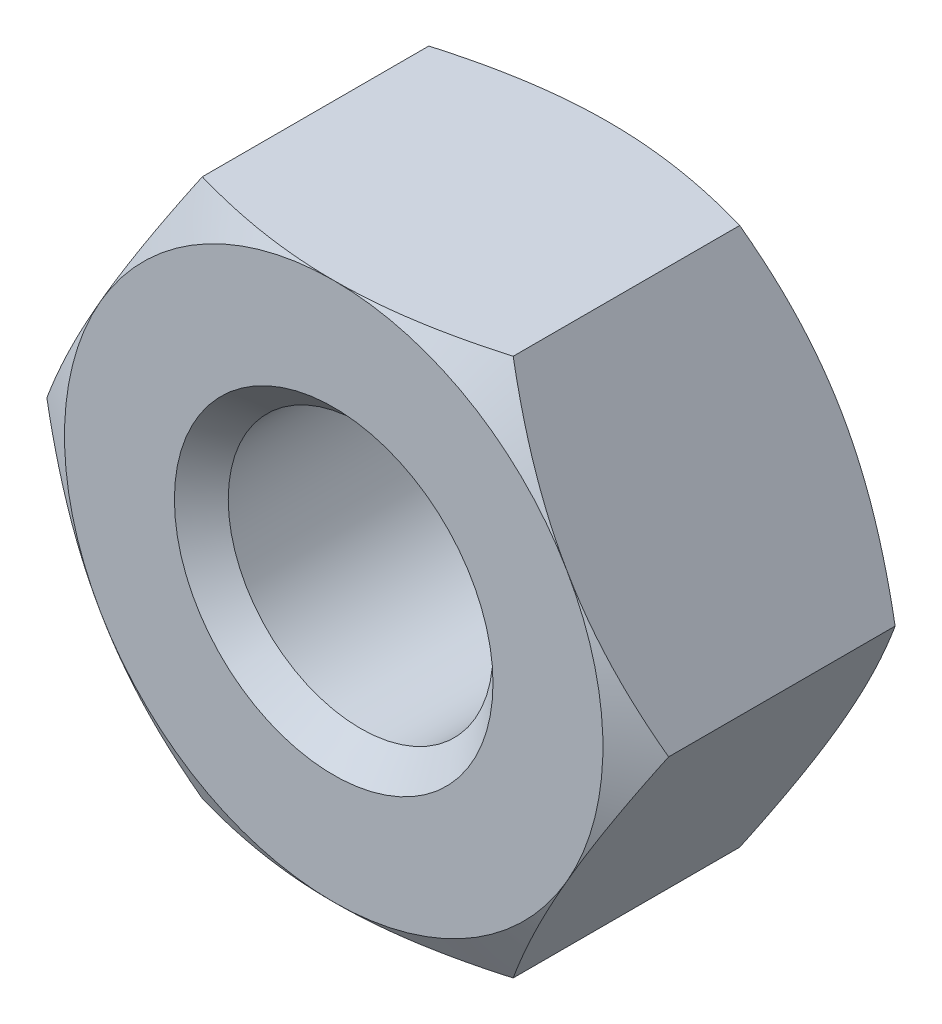
ISO-10303-21;
HEADER;
FILE_DESCRIPTION(('STEP AP214'),'2;1');
FILE_NAME('part.step','',(''),(''),'','','');
FILE_SCHEMA(('AUTOMOTIVE_DESIGN { 1 0 10303 214 1 1 1 1 }'));
ENDSEC;
DATA;
#1=APPLICATION_CONTEXT('core data for automotive mechanical design processes');
#2=APPLICATION_PROTOCOL_DEFINITION('international standard','automotive_design',2000,#1);
#3=PRODUCT_CONTEXT('',#1,'mechanical');
#4=PRODUCT('Part','Part','',(#3));
#5=PRODUCT_RELATED_PRODUCT_CATEGORY('part','',(#4));
#6=PRODUCT_DEFINITION_FORMATION('','',#4);
#7=PRODUCT_DEFINITION_CONTEXT('part definition',#1,'design');
#8=PRODUCT_DEFINITION('design','',#6,#7);
#9=PRODUCT_DEFINITION_SHAPE('','',#8);
#10=(LENGTH_UNIT() NAMED_UNIT(*) SI_UNIT(.MILLI.,.METRE.));
#11=(NAMED_UNIT(*) PLANE_ANGLE_UNIT() SI_UNIT($,.RADIAN.));
#12=(NAMED_UNIT(*) SI_UNIT($,.STERADIAN.) SOLID_ANGLE_UNIT());
#13=UNCERTAINTY_MEASURE_WITH_UNIT(LENGTH_MEASURE(1.E-05),#10,'distance_accuracy_value','');
#14=(GEOMETRIC_REPRESENTATION_CONTEXT(3) GLOBAL_UNCERTAINTY_ASSIGNED_CONTEXT((#13)) GLOBAL_UNIT_ASSIGNED_CONTEXT((#10,
#11,#12)) REPRESENTATION_CONTEXT('',''));
#15=CARTESIAN_POINT('',(0.,0.,0.));
#16=DIRECTION('',(0.,0.,1.));
#17=DIRECTION('',(1.,0.,0.));
#18=AXIS2_PLACEMENT_3D('',#15,#16,#17);
#19=CARTESIAN_POINT('',(-5.77350269189626,0.,5.1));
#20=DIRECTION('',(0.866025403784439,0.5,0.));
#21=DIRECTION('',(-0.5,0.866025403784439,0.));
#22=AXIS2_PLACEMENT_3D('',#19,#20,#21);
#23=PLANE('',#22);
#24=CARTESIAN_POINT('',(-2.88663587589429,-5.0002,0.446648656051829));
#25=CARTESIAN_POINT('',(-3.01349970319368,-4.78046540547481,0.373386567637635));
#26=CARTESIAN_POINT('',(-3.14144859993849,-4.55885141554042,0.306751321918092));
#27=CARTESIAN_POINT('',(-3.39956193532121,-4.11178600454648,0.19043899101081));
#28=CARTESIAN_POINT('',(-3.52973095989718,-3.88632664040922,0.140803049915788));
#29=CARTESIAN_POINT('',(-3.78847564779798,-3.43816769477649,0.0635510254186966));
#30=CARTESIAN_POINT('',(-3.91701101576052,-3.2155379068958,0.0354203782834878));
#31=CARTESIAN_POINT('',(-4.11026620624323,-2.88081009815335,0.0101949219536832));
#32=CARTESIAN_POINT('',(-4.17472868879311,-2.76915780319493,0.00461345976948283));
#33=CARTESIAN_POINT('',(-4.30371322717528,-2.5457500293262,-0.000797783248530725));
#34=CARTESIAN_POINT('',(-4.36823528110589,-2.43399455370968,-0.000627741741797583));
#35=CARTESIAN_POINT('',(-4.54500768479194,-2.12781576914936,0.00775363179203579));
#36=CARTESIAN_POINT('',(-4.65719946015293,-1.93349391403278,0.0218297718972512));
#37=CARTESIAN_POINT('',(-4.88083840557981,-1.54613989800229,0.066465257109431));
#38=CARTESIAN_POINT('',(-4.9922847895602,-1.35310909862843,0.0970398601475082));
#39=CARTESIAN_POINT('',(-5.21637431361295,-0.964974657525143,0.173468493621164));
#40=CARTESIAN_POINT('',(-5.32898917185759,-0.769920001358262,0.21964637887868));
#41=CARTESIAN_POINT('',(-5.55253939626498,-0.382719654641231,0.324451794491934));
#42=CARTESIAN_POINT('',(-5.66347762579591,-0.190569004591913,0.383054703437374));
#43=CARTESIAN_POINT('',(-5.77361816195009,0.000199999999999551,0.446648656051829));
#44=B_SPLINE_CURVE_WITH_KNOTS('',3,(#24,#25,#26,#27,#28,#29,#30,#31,#32,#33,#34,#35,#36,#37,#38,
#39,#40,#41,#42,#43),.UNSPECIFIED.,.F.,.F.,(4,2,2,2,2,2,2,2,2,4),(0.,0.792555841363091,
1.58701660053334,2.36181537487281,2.74884076077326,3.13585419177295,3.80962362599679,
4.48401723901189,5.17336882348928,5.86136694793725),.UNSPECIFIED.);
#45=CARTESIAN_POINT('',(-2.88675134594813,-5.,0.446581987385202));
#46=VERTEX_POINT('',#45);
#47=CARTESIAN_POINT('',(-4.3301270189222,-2.5,0.));
#48=VERTEX_POINT('',#47);
#49=EDGE_CURVE('E625',#46,#48,#44,.T.);
#50=ORIENTED_EDGE('',*,*,#49,.F.);
#51=DIRECTION('',(0.,0.,-1.));
#52=VECTOR('',#51,1.);
#53=CARTESIAN_POINT('',(-2.88675134594813,-5.,5.1));
#54=LINE('',#53,#52);
#55=CARTESIAN_POINT('',(-2.88675134594813,-5.,4.6534180126148));
#56=VERTEX_POINT('',#55);
#57=EDGE_CURVE('E133',#56,#46,#54,.T.);
#58=ORIENTED_EDGE('',*,*,#57,.F.);
#59=CARTESIAN_POINT('',(-2.88663587589429,-5.0002,4.65335134394817));
#60=CARTESIAN_POINT('',(-3.01349970319368,-4.78046540547481,4.72661343236237));
#61=CARTESIAN_POINT('',(-3.14144859993849,-4.55885141554042,4.79324867808191));
#62=CARTESIAN_POINT('',(-3.39956193532121,-4.11178600454648,4.90956100898919));
#63=CARTESIAN_POINT('',(-3.52973095989718,-3.88632664040922,4.95919695008421));
#64=CARTESIAN_POINT('',(-3.78847564779798,-3.43816769477649,5.0364489745813));
#65=CARTESIAN_POINT('',(-3.91701101576052,-3.2155379068958,5.06457962171651));
#66=CARTESIAN_POINT('',(-4.11026620624323,-2.88081009815335,5.08980507804632));
#67=CARTESIAN_POINT('',(-4.17472868879311,-2.76915780319493,5.09538654023052));
#68=CARTESIAN_POINT('',(-4.30371322717528,-2.5457500293262,5.10079778324853));
#69=CARTESIAN_POINT('',(-4.36823528110589,-2.43399455370968,5.1006277417418));
#70=CARTESIAN_POINT('',(-4.54500768479194,-2.12781576914936,5.09224636820796));
#71=CARTESIAN_POINT('',(-4.65719946015293,-1.93349391403278,5.07817022810275));
#72=CARTESIAN_POINT('',(-4.88083840557981,-1.54613989800229,5.03353474289057));
#73=CARTESIAN_POINT('',(-4.9922847895602,-1.35310909862843,5.00296013985249));
#74=CARTESIAN_POINT('',(-5.21637431361295,-0.964974657525143,4.92653150637884));
#75=CARTESIAN_POINT('',(-5.32898917185759,-0.769920001358262,4.88035362112132));
#76=CARTESIAN_POINT('',(-5.55253939626498,-0.382719654641231,4.77554820550807));
#77=CARTESIAN_POINT('',(-5.66347762579591,-0.190569004591913,4.71694529656263));
#78=CARTESIAN_POINT('',(-5.77361816195009,0.000199999999999537,4.65335134394817));
#79=B_SPLINE_CURVE_WITH_KNOTS('',3,(#59,#60,#61,#62,#63,#64,#65,#66,#67,#68,#69,#70,#71,#72,#73,
#74,#75,#76,#77,#78),.UNSPECIFIED.,.F.,.F.,(4,2,2,2,2,2,2,2,2,4),(0.,0.792555841363091,
1.58701660053334,2.36181537487281,2.74884076077326,3.13585419177295,3.80962362599679,
4.48401723901189,5.17336882348928,5.86136694793725),.UNSPECIFIED.);
#80=CARTESIAN_POINT('',(-4.3301270189222,-2.5,5.1));
#81=VERTEX_POINT('',#80);
#82=EDGE_CURVE('E622',#56,#81,#79,.T.);
#83=ORIENTED_EDGE('',*,*,#82,.T.);
#84=CARTESIAN_POINT('',(-5.77350269189626,0.,4.6534180126148));
#85=VERTEX_POINT('',#84);
#86=EDGE_CURVE('E222',#81,#85,#79,.T.);
#87=ORIENTED_EDGE('',*,*,#86,.T.);
#88=DIRECTION('',(0.,0.,-1.));
#89=VECTOR('',#88,1.);
#90=CARTESIAN_POINT('',(-5.77350269189626,0.,5.1));
#91=LINE('',#90,#89);
#92=CARTESIAN_POINT('',(-5.77350269189626,0.,0.446581987385203));
#93=VERTEX_POINT('',#92);
#94=EDGE_CURVE('E210',#85,#93,#91,.T.);
#95=ORIENTED_EDGE('',*,*,#94,.T.);
#96=EDGE_CURVE('E219',#48,#93,#44,.T.);
#97=ORIENTED_EDGE('',*,*,#96,.F.);
#98=EDGE_LOOP('',(#50,#58,#83,#87,#95,#97));
#99=FACE_BOUND('',#98,.T.);
#100=ADVANCED_FACE('F15',(#99),#23,.F.);
#101=CARTESIAN_POINT('',(-2.88675134594813,-5.,5.1));
#102=DIRECTION('',(0.,1.,0.));
#103=DIRECTION('',(-1.,0.,0.));
#104=AXIS2_PLACEMENT_3D('',#101,#102,#103);
#105=PLANE('',#104);
#106=CARTESIAN_POINT('',(-7.65608998744864,-4.99999999999999,2.39263352655079));
#107=CARTESIAN_POINT('',(-7.43656171400165,-5.,2.28654533817206));
#108=CARTESIAN_POINT('',(-7.21651440170021,-5.,2.18151175461595));
#109=CARTESIAN_POINT('',(-6.77510105921518,-5.,1.97415643363975));
#110=CARTESIAN_POINT('',(-6.55373480873052,-5.,1.87183516574568));
#111=CARTESIAN_POINT('',(-6.10820714710356,-5.,1.6699680785349));
#112=CARTESIAN_POINT('',(-5.88403698971123,-5.,1.5704414928173));
#113=CARTESIAN_POINT('',(-5.43385418074676,-5.,1.37566323278681));
#114=CARTESIAN_POINT('',(-5.20784162594277,-5.,1.28041133564242));
#115=CARTESIAN_POINT('',(-4.75080884782755,-5.,1.09418830918941));
#116=CARTESIAN_POINT('',(-4.51976121099504,-5.,1.00328409099869));
#117=CARTESIAN_POINT('',(-4.05494053422099,-5.,0.828595302971944));
#118=CARTESIAN_POINT('',(-3.82116719434024,-5.,0.744811525247647));
#119=CARTESIAN_POINT('',(-3.35100416711888,-5.,0.586614632364614));
#120=CARTESIAN_POINT('',(-3.11462125088187,-5.,0.512181595225267));
#121=CARTESIAN_POINT('',(-2.63849247870023,-5.,0.375104393872373));
#122=CARTESIAN_POINT('',(-2.39874771210329,-5.,0.312456501596946));
#123=CARTESIAN_POINT('',(-1.91574303714496,-5.,0.201987753994866));
#124=CARTESIAN_POINT('',(-1.67248221084099,-5.,0.154170846558639));
#125=CARTESIAN_POINT('',(-1.18299359688663,-5.,0.0765955557923999));
#126=CARTESIAN_POINT('',(-0.936765806613275,-5.,0.0468371884284065));
#127=CARTESIAN_POINT('',(-0.567032279323842,-5.,0.0176512015862943));
#128=CARTESIAN_POINT('',(-0.444105297658534,-5.,0.0104963190599451));
#129=CARTESIAN_POINT('',(-0.19805300523856,-5.,0.00139545226903921));
#130=CARTESIAN_POINT('',(-0.0749276970802241,-5.,-0.00055059963961613));
#131=CARTESIAN_POINT('',(0.171257999892357,-5.,0.000818470345662526));
#132=CARTESIAN_POINT('',(0.294318397227092,-5.,0.00413211431301022));
#133=CARTESIAN_POINT('',(0.540192730788844,-5.,0.0159365972827587));
#134=CARTESIAN_POINT('',(0.663006654263487,-5.,0.0244276975701636));
#135=CARTESIAN_POINT('',(0.960681872881671,-5.,0.0511063802752996));
#136=CARTESIAN_POINT('',(1.1353143627994,-5.,0.0718889676982853));
#137=CARTESIAN_POINT('',(1.48321675799389,-5.,0.122765655722695));
#138=CARTESIAN_POINT('',(1.65648647841237,-5.,0.152860997990034));
#139=CARTESIAN_POINT('',(2.001554260587,-5.,0.221298792011551));
#140=CARTESIAN_POINT('',(2.17335067370374,-5.,0.259649477486405));
#141=CARTESIAN_POINT('',(2.51518168221055,-5.,0.343428305385012));
#142=CARTESIAN_POINT('',(2.68521638419311,-5.,0.388856016914002));
#143=CARTESIAN_POINT('',(3.02770318928893,-5.,0.486887782054294));
#144=CARTESIAN_POINT('',(3.20011248435313,-5.,0.539640363823944));
#145=CARTESIAN_POINT('',(3.54310870430178,-5.,0.650357787302628));
#146=CARTESIAN_POINT('',(3.71369679659716,-5.,0.708319033907072));
#147=CARTESIAN_POINT('',(4.05236610267975,-5.,0.828256540728477));
#148=CARTESIAN_POINT('',(4.22045602230057,-5.,0.890208365426368));
#149=CARTESIAN_POINT('',(4.5553317168745,-5.,1.01774823413812));
#150=CARTESIAN_POINT('',(4.72211693321416,-5.,1.08333774778778));
#151=CARTESIAN_POINT('',(4.88829623733357,-5.,1.15038625817725));
#152=B_SPLINE_CURVE_WITH_KNOTS('',3,(#106,#107,#108,#109,#110,#111,#112,#113,#114,#115,#116,
#117,#118,#119,#120,#121,#122,#123,#124,#125,#126,#127,#128,#129,#130,#131,#132,#133,#134,#135,
#136,#137,#138,#139,#140,#141,#142,#143,#144,#145,#146,#147,#148,#149,#150,#151),.UNSPECIFIED.,
.F.,.F.,(4,2,2,2,2,2,2,2,2,2,2,2,2,2,2,2,2,2,2,2,2,2,4),(0.,0.731464740665349,1.46305528824908,
2.19883243307486,2.93457117856033,3.67934251246857,4.42419659013361,5.16743580871989,
5.91043951739338,6.65364083834806,7.39684281638515,7.76615414335456,8.1354606742661,
8.50466345177855,8.87388486298452,9.40118542949727,9.92855633110015,10.4564556797854,
10.9843228991235,11.525120280828,12.065547221064,12.6029322754131,13.1405360390026),.UNSPECIFIED.);
#153=CARTESIAN_POINT('',(2.88675134594813,-5.,0.446581987385203));
#154=VERTEX_POINT('',#153);
#155=CARTESIAN_POINT('',(0.,-5.,0.));
#156=VERTEX_POINT('',#155);
#157=EDGE_CURVE('E114',#154,#156,#152,.F.);
#158=ORIENTED_EDGE('',*,*,#157,.F.);
#159=DIRECTION('',(0.,0.,-1.));
#160=VECTOR('',#159,1.);
#161=CARTESIAN_POINT('',(2.88675134594813,-5.,5.1));
#162=LINE('',#161,#160);
#163=CARTESIAN_POINT('',(2.88675134594813,-5.,4.6534180126148));
#164=VERTEX_POINT('',#163);
#165=EDGE_CURVE('E130',#164,#154,#162,.T.);
#166=ORIENTED_EDGE('',*,*,#165,.F.);
#167=CARTESIAN_POINT('',(-7.65608998744864,-4.99999999999999,2.70736647344921));
#168=CARTESIAN_POINT('',(-7.43656171400165,-5.,2.81345466182794));
#169=CARTESIAN_POINT('',(-7.21651440170021,-5.,2.91848824538405));
#170=CARTESIAN_POINT('',(-6.77510105921518,-5.,3.12584356636025));
#171=CARTESIAN_POINT('',(-6.55373480873052,-5.,3.22816483425432));
#172=CARTESIAN_POINT('',(-6.10820714710356,-5.,3.4300319214651));
#173=CARTESIAN_POINT('',(-5.88403698971124,-5.,3.5295585071827));
#174=CARTESIAN_POINT('',(-5.43385418074676,-5.,3.72433676721319));
#175=CARTESIAN_POINT('',(-5.20784162594277,-5.,3.81958866435758));
#176=CARTESIAN_POINT('',(-4.75080884782755,-5.,4.00581169081059));
#177=CARTESIAN_POINT('',(-4.51976121099504,-5.,4.09671590900131));
#178=CARTESIAN_POINT('',(-4.05494053422099,-5.,4.27140469702806));
#179=CARTESIAN_POINT('',(-3.82116719434024,-5.,4.35518847475235));
#180=CARTESIAN_POINT('',(-3.35100416711888,-5.,4.51338536763539));
#181=CARTESIAN_POINT('',(-3.11462125088187,-5.,4.58781840477473));
#182=CARTESIAN_POINT('',(-2.63849247870023,-5.,4.72489560612763));
#183=CARTESIAN_POINT('',(-2.39874771210329,-5.,4.78754349840305));
#184=CARTESIAN_POINT('',(-1.91574303714496,-5.,4.89801224600513));
#185=CARTESIAN_POINT('',(-1.67248221084099,-5.,4.94582915344136));
#186=CARTESIAN_POINT('',(-1.18299359688663,-5.,5.0234044442076));
#187=CARTESIAN_POINT('',(-0.936765806613275,-5.,5.05316281157159));
#188=CARTESIAN_POINT('',(-0.567032279323842,-5.,5.08234879841371));
#189=CARTESIAN_POINT('',(-0.444105297658534,-5.,5.08950368094006));
#190=CARTESIAN_POINT('',(-0.19805300523856,-5.,5.09860454773096));
#191=CARTESIAN_POINT('',(-0.0749276970802238,-5.,5.10055059963962));
#192=CARTESIAN_POINT('',(0.171257999892357,-5.,5.09918152965434));
#193=CARTESIAN_POINT('',(0.294318397227092,-5.,5.09586788568699));
#194=CARTESIAN_POINT('',(0.540192730788844,-5.,5.08406340271724));
#195=CARTESIAN_POINT('',(0.663006654263487,-5.,5.07557230242984));
#196=CARTESIAN_POINT('',(0.960681872881671,-5.,5.0488936197247));
#197=CARTESIAN_POINT('',(1.1353143627994,-5.,5.02811103230171));
#198=CARTESIAN_POINT('',(1.48321675799389,-5.,4.97723434427731));
#199=CARTESIAN_POINT('',(1.65648647841237,-5.,4.94713900200997));
#200=CARTESIAN_POINT('',(2.001554260587,-5.,4.87870120798845));
#201=CARTESIAN_POINT('',(2.17335067370374,-5.,4.84035052251359));
#202=CARTESIAN_POINT('',(2.51518168221055,-5.,4.75657169461499));
#203=CARTESIAN_POINT('',(2.68521638419312,-5.,4.711143983086));
#204=CARTESIAN_POINT('',(3.02770318928893,-5.,4.61311221794571));
#205=CARTESIAN_POINT('',(3.20011248435313,-5.,4.56035963617606));
#206=CARTESIAN_POINT('',(3.54310870430178,-5.,4.44964221269737));
#207=CARTESIAN_POINT('',(3.71369679659716,-5.,4.39168096609293));
#208=CARTESIAN_POINT('',(4.05236610267975,-5.,4.27174345927152));
#209=CARTESIAN_POINT('',(4.22045602230057,-5.,4.20979163457363));
#210=CARTESIAN_POINT('',(4.5553317168745,-5.,4.08225176586188));
#211=CARTESIAN_POINT('',(4.72211693321416,-5.,4.01666225221222));
#212=CARTESIAN_POINT('',(4.88829623733357,-5.,3.94961374182275));
#213=B_SPLINE_CURVE_WITH_KNOTS('',3,(#167,#168,#169,#170,#171,#172,#173,#174,#175,#176,#177,
#178,#179,#180,#181,#182,#183,#184,#185,#186,#187,#188,#189,#190,#191,#192,#193,#194,#195,#196,
#197,#198,#199,#200,#201,#202,#203,#204,#205,#206,#207,#208,#209,#210,#211,#212),.UNSPECIFIED.,
.F.,.F.,(4,2,2,2,2,2,2,2,2,2,2,2,2,2,2,2,2,2,2,2,2,2,4),(0.,0.73146474066535,1.46305528824908,
2.19883243307486,2.93457117856033,3.67934251246857,4.42419659013361,5.16743580871989,
5.91043951739338,6.65364083834806,7.39684281638515,7.76615414335456,8.1354606742661,
8.50466345177855,8.87388486298452,9.40118542949726,9.92855633110014,10.4564556797854,
10.9843228991235,11.525120280828,12.065547221064,12.6029322754131,13.1405360390026),.UNSPECIFIED.);
#214=CARTESIAN_POINT('',(0.,-5.,5.1));
#215=VERTEX_POINT('',#214);
#216=EDGE_CURVE('E617',#164,#215,#213,.F.);
#217=ORIENTED_EDGE('',*,*,#216,.T.);
#218=EDGE_CURVE('E233',#215,#56,#213,.F.);
#219=ORIENTED_EDGE('',*,*,#218,.T.);
#220=ORIENTED_EDGE('',*,*,#57,.T.);
#221=EDGE_CURVE('E595',#156,#46,#152,.F.);
#222=ORIENTED_EDGE('',*,*,#221,.F.);
#223=EDGE_LOOP('',(#158,#166,#217,#219,#220,#222));
#224=FACE_BOUND('',#223,.T.);
#225=ADVANCED_FACE('F177',(#224),#105,.F.);
#226=CARTESIAN_POINT('',(2.88675134594813,-5.,5.1));
#227=DIRECTION('',(-0.866025403784439,0.5,0.));
#228=DIRECTION('',(-0.5,-0.866025403784439,0.));
#229=AXIS2_PLACEMENT_3D('',#226,#227,#228);
#230=PLANE('',#229);
#231=CARTESIAN_POINT('',(5.77361816195009,0.0002,0.446648656051829));
#232=CARTESIAN_POINT('',(5.6467543346507,-0.219534594525185,0.373386567637634));
#233=CARTESIAN_POINT('',(5.51880543790589,-0.441148584459581,0.306751321918091));
#234=CARTESIAN_POINT('',(5.26069210252318,-0.888213995453515,0.19043899101081));
#235=CARTESIAN_POINT('',(5.13052307794721,-1.11367335959078,0.140803049915788));
#236=CARTESIAN_POINT('',(4.87177839004641,-1.56183230522351,0.0635510254186971));
#237=CARTESIAN_POINT('',(4.74324302208387,-1.78446209310419,0.0354203782834883));
#238=CARTESIAN_POINT('',(4.54998783160116,-2.11918990184664,0.0101949219536838));
#239=CARTESIAN_POINT('',(4.48552534905128,-2.23084219680506,0.00461345976948352));
#240=CARTESIAN_POINT('',(4.35654081066911,-2.4542499706738,-0.000797783248530162));
#241=CARTESIAN_POINT('',(4.2920187567385,-2.56600544629032,-0.000627741741797174));
#242=CARTESIAN_POINT('',(4.11524635305244,-2.87218423085064,0.00775363179203611));
#243=CARTESIAN_POINT('',(4.00305457769146,-3.06650608596722,0.0218297718972519));
#244=CARTESIAN_POINT('',(3.77941563226457,-3.45386010199771,0.0664652571094316));
#245=CARTESIAN_POINT('',(3.66796924828418,-3.64689090137157,0.0970398601475086));
#246=CARTESIAN_POINT('',(3.44387972423144,-4.03502534247485,0.173468493621164));
#247=CARTESIAN_POINT('',(3.3312648659868,-4.23007999864174,0.219646378878681));
#248=CARTESIAN_POINT('',(3.10771464157941,-4.61728034535877,0.324451794491936));
#249=CARTESIAN_POINT('',(2.99677641204847,-4.80943099540808,0.383054703437376));
#250=CARTESIAN_POINT('',(2.88663587589429,-5.0002,0.44664865605183));
#251=B_SPLINE_CURVE_WITH_KNOTS('',3,(#231,#232,#233,#234,#235,#236,#237,#238,#239,#240,#241,
#242,#243,#244,#245,#246,#247,#248,#249,#250),.UNSPECIFIED.,.F.,.F.,(4,2,2,2,2,2,2,2,2,4),(0.,
0.792555841363091,1.58701660053334,2.36181537487281,2.74884076077326,3.13585419177295,
3.80962362599679,4.48401723901189,5.17336882348928,5.86136694793725),.UNSPECIFIED.);
#252=CARTESIAN_POINT('',(5.77350269189626,0.,0.446581987385201));
#253=VERTEX_POINT('',#252);
#254=CARTESIAN_POINT('',(4.3301270189222,-2.5,0.));
#255=VERTEX_POINT('',#254);
#256=EDGE_CURVE('E108',#253,#255,#251,.T.);
#257=ORIENTED_EDGE('',*,*,#256,.F.);
#258=DIRECTION('',(0.,0.,-1.));
#259=VECTOR('',#258,1.);
#260=CARTESIAN_POINT('',(5.77350269189626,0.,5.1));
#261=LINE('',#260,#259);
#262=CARTESIAN_POINT('',(5.77350269189626,0.,4.6534180126148));
#263=VERTEX_POINT('',#262);
#264=EDGE_CURVE('E121',#263,#253,#261,.T.);
#265=ORIENTED_EDGE('',*,*,#264,.F.);
#266=CARTESIAN_POINT('',(5.77361816195009,0.0002,4.65335134394817));
#267=CARTESIAN_POINT('',(5.6467543346507,-0.219534594525185,4.72661343236237));
#268=CARTESIAN_POINT('',(5.51880543790589,-0.441148584459581,4.79324867808191));
#269=CARTESIAN_POINT('',(5.26069210252318,-0.888213995453514,4.90956100898919));
#270=CARTESIAN_POINT('',(5.13052307794721,-1.11367335959078,4.95919695008421));
#271=CARTESIAN_POINT('',(4.87177839004641,-1.56183230522351,5.0364489745813));
#272=CARTESIAN_POINT('',(4.74324302208387,-1.78446209310419,5.06457962171651));
#273=CARTESIAN_POINT('',(4.54998783160116,-2.11918990184664,5.08980507804632));
#274=CARTESIAN_POINT('',(4.48552534905128,-2.23084219680506,5.09538654023052));
#275=CARTESIAN_POINT('',(4.35654081066911,-2.4542499706738,5.10079778324853));
#276=CARTESIAN_POINT('',(4.2920187567385,-2.56600544629032,5.1006277417418));
#277=CARTESIAN_POINT('',(4.11524635305244,-2.87218423085064,5.09224636820796));
#278=CARTESIAN_POINT('',(4.00305457769146,-3.06650608596722,5.07817022810275));
#279=CARTESIAN_POINT('',(3.77941563226457,-3.45386010199771,5.03353474289057));
#280=CARTESIAN_POINT('',(3.66796924828418,-3.64689090137157,5.00296013985249));
#281=CARTESIAN_POINT('',(3.44387972423144,-4.03502534247485,4.92653150637884));
#282=CARTESIAN_POINT('',(3.3312648659868,-4.23007999864174,4.88035362112132));
#283=CARTESIAN_POINT('',(3.10771464157941,-4.61728034535877,4.77554820550806));
#284=CARTESIAN_POINT('',(2.99677641204847,-4.80943099540808,4.71694529656262));
#285=CARTESIAN_POINT('',(2.88663587589429,-5.0002,4.65335134394817));
#286=B_SPLINE_CURVE_WITH_KNOTS('',3,(#266,#267,#268,#269,#270,#271,#272,#273,#274,#275,#276,
#277,#278,#279,#280,#281,#282,#283,#284,#285),.UNSPECIFIED.,.F.,.F.,(4,2,2,2,2,2,2,2,2,4),(0.,
0.792555841363091,1.58701660053334,2.36181537487281,2.74884076077326,3.13585419177295,
3.80962362599679,4.48401723901189,5.17336882348928,5.86136694793725),.UNSPECIFIED.);
#287=CARTESIAN_POINT('',(4.3301270189222,-2.5,5.1));
#288=VERTEX_POINT('',#287);
#289=EDGE_CURVE('E223',#263,#288,#286,.T.);
#290=ORIENTED_EDGE('',*,*,#289,.T.);
#291=EDGE_CURVE('E225',#288,#164,#286,.T.);
#292=ORIENTED_EDGE('',*,*,#291,.T.);
#293=ORIENTED_EDGE('',*,*,#165,.T.);
#294=EDGE_CURVE('E113',#255,#154,#251,.T.);
#295=ORIENTED_EDGE('',*,*,#294,.F.);
#296=EDGE_LOOP('',(#257,#265,#290,#292,#293,#295));
#297=FACE_BOUND('',#296,.T.);
#298=ADVANCED_FACE('F119',(#297),#230,.F.);
#299=CARTESIAN_POINT('',(5.77350269189626,0.,5.1));
#300=DIRECTION('',(-0.866025403784439,-0.5,0.));
#301=DIRECTION('',(0.5,-0.866025403784439,0.));
#302=AXIS2_PLACEMENT_3D('',#299,#300,#301);
#303=PLANE('',#302);
#304=CARTESIAN_POINT('',(2.88663587589429,5.0002,0.446648656051831));
#305=CARTESIAN_POINT('',(3.01349970319368,4.78046540547482,0.373386567637637));
#306=CARTESIAN_POINT('',(3.14144859993849,4.55885141554042,0.306751321918094));
#307=CARTESIAN_POINT('',(3.39956193532121,4.11178600454649,0.190438991010812));
#308=CARTESIAN_POINT('',(3.52973095989718,3.88632664040923,0.140803049915789));
#309=CARTESIAN_POINT('',(3.78847564779798,3.43816769477649,0.0635510254186976));
#310=CARTESIAN_POINT('',(3.91701101576052,3.21553790689581,0.0354203782834887));
#311=CARTESIAN_POINT('',(4.11026620624323,2.88081009815336,0.0101949219536837));
#312=CARTESIAN_POINT('',(4.17472868879311,2.76915780319494,0.00461345976948315));
#313=CARTESIAN_POINT('',(4.30371322717528,2.5457500293262,-0.000797783248530544));
#314=CARTESIAN_POINT('',(4.36823528110589,2.43399455370968,-0.000627741741797343));
#315=CARTESIAN_POINT('',(4.54500768479194,2.12781576914936,0.00775363179203605));
#316=CARTESIAN_POINT('',(4.65719946015293,1.93349391403278,0.0218297718972513));
#317=CARTESIAN_POINT('',(4.88083840557981,1.54613989800229,0.0664652571094309));
#318=CARTESIAN_POINT('',(4.9922847895602,1.35310909862843,0.0970398601475082));
#319=CARTESIAN_POINT('',(5.21637431361295,0.964974657525143,0.173468493621164));
#320=CARTESIAN_POINT('',(5.32898917185759,0.769920001358262,0.21964637887868));
#321=CARTESIAN_POINT('',(5.55253939626498,0.38271965464123,0.324451794491935));
#322=CARTESIAN_POINT('',(5.66347762579592,0.190569004591912,0.383054703437375));
#323=CARTESIAN_POINT('',(5.77361816195009,-0.000200000000000801,0.44664865605183));
#324=B_SPLINE_CURVE_WITH_KNOTS('',3,(#304,#305,#306,#307,#308,#309,#310,#311,#312,#313,#314,
#315,#316,#317,#318,#319,#320,#321,#322,#323),.UNSPECIFIED.,.F.,.F.,(4,2,2,2,2,2,2,2,2,4),(0.,
0.792555841363092,1.58701660053334,2.36181537487281,2.74884076077326,3.13585419177295,
3.80962362599679,4.48401723901189,5.17336882348929,5.86136694793725),.UNSPECIFIED.);
#325=CARTESIAN_POINT('',(2.88675134594812,5.,0.446581987385203));
#326=VERTEX_POINT('',#325);
#327=CARTESIAN_POINT('',(4.33012701892219,2.5,0.));
#328=VERTEX_POINT('',#327);
#329=EDGE_CURVE('E116',#326,#328,#324,.T.);
#330=ORIENTED_EDGE('',*,*,#329,.F.);
#331=DIRECTION('',(0.,0.,-1.));
#332=VECTOR('',#331,1.);
#333=CARTESIAN_POINT('',(2.88675134594813,5.,5.1));
#334=LINE('',#333,#332);
#335=CARTESIAN_POINT('',(2.88675134594812,5.,4.6534180126148));
#336=VERTEX_POINT('',#335);
#337=EDGE_CURVE('E131',#336,#326,#334,.T.);
#338=ORIENTED_EDGE('',*,*,#337,.F.);
#339=CARTESIAN_POINT('',(2.88663587589429,5.0002,4.65335134394817));
#340=CARTESIAN_POINT('',(3.01349970319368,4.78046540547482,4.72661343236236));
#341=CARTESIAN_POINT('',(3.14144859993849,4.55885141554042,4.79324867808191));
#342=CARTESIAN_POINT('',(3.39956193532121,4.11178600454649,4.90956100898919));
#343=CARTESIAN_POINT('',(3.52973095989718,3.88632664040923,4.95919695008421));
#344=CARTESIAN_POINT('',(3.78847564779798,3.43816769477649,5.0364489745813));
#345=CARTESIAN_POINT('',(3.91701101576052,3.21553790689581,5.06457962171651));
#346=CARTESIAN_POINT('',(4.11026620624323,2.88081009815336,5.08980507804632));
#347=CARTESIAN_POINT('',(4.17472868879311,2.76915780319494,5.09538654023052));
#348=CARTESIAN_POINT('',(4.30371322717528,2.5457500293262,5.10079778324853));
#349=CARTESIAN_POINT('',(4.36823528110589,2.43399455370968,5.1006277417418));
#350=CARTESIAN_POINT('',(4.54500768479194,2.12781576914936,5.09224636820796));
#351=CARTESIAN_POINT('',(4.65719946015292,1.93349391403278,5.07817022810275));
#352=CARTESIAN_POINT('',(4.88083840557981,1.54613989800229,5.03353474289057));
#353=CARTESIAN_POINT('',(4.9922847895602,1.35310909862843,5.00296013985249));
#354=CARTESIAN_POINT('',(5.21637431361295,0.964974657525143,4.92653150637884));
#355=CARTESIAN_POINT('',(5.32898917185759,0.769920001358262,4.88035362112132));
#356=CARTESIAN_POINT('',(5.55253939626498,0.38271965464123,4.77554820550807));
#357=CARTESIAN_POINT('',(5.66347762579592,0.190569004591912,4.71694529656263));
#358=CARTESIAN_POINT('',(5.77361816195009,-0.000200000000000814,4.65335134394817));
#359=B_SPLINE_CURVE_WITH_KNOTS('',3,(#339,#340,#341,#342,#343,#344,#345,#346,#347,#348,#349,
#350,#351,#352,#353,#354,#355,#356,#357,#358),.UNSPECIFIED.,.F.,.F.,(4,2,2,2,2,2,2,2,2,4),(0.,
0.792555841363092,1.58701660053334,2.36181537487281,2.74884076077326,3.13585419177295,
3.80962362599679,4.48401723901189,5.17336882348929,5.86136694793725),.UNSPECIFIED.);
#360=CARTESIAN_POINT('',(4.3301270189222,2.5,5.1));
#361=VERTEX_POINT('',#360);
#362=EDGE_CURVE('E271',#336,#361,#359,.T.);
#363=ORIENTED_EDGE('',*,*,#362,.T.);
#364=EDGE_CURVE('E129',#361,#263,#359,.T.);
#365=ORIENTED_EDGE('',*,*,#364,.T.);
#366=ORIENTED_EDGE('',*,*,#264,.T.);
#367=EDGE_CURVE('E105',#328,#253,#324,.T.);
#368=ORIENTED_EDGE('',*,*,#367,.F.);
#369=EDGE_LOOP('',(#330,#338,#363,#365,#366,#368));
#370=FACE_BOUND('',#369,.T.);
#371=ADVANCED_FACE('F126',(#370),#303,.F.);
#372=CARTESIAN_POINT('',(2.88675134594813,5.,5.1));
#373=DIRECTION('',(0.,-1.,0.));
#374=DIRECTION('',(1.,0.,0.));
#375=AXIS2_PLACEMENT_3D('',#372,#373,#374);
#376=PLANE('',#375);
#377=CARTESIAN_POINT('',(-7.65608998744864,5.00000000000001,2.3926335265508));
#378=CARTESIAN_POINT('',(-7.43656171400166,5.00000000000001,2.28654533817207));
#379=CARTESIAN_POINT('',(-7.21651440170021,5.00000000000001,2.18151175461595));
#380=CARTESIAN_POINT('',(-6.77510105921518,5.00000000000001,1.97415643363976));
#381=CARTESIAN_POINT('',(-6.55373480873052,5.00000000000001,1.87183516574568));
#382=CARTESIAN_POINT('',(-6.10820714710356,5.00000000000001,1.66996807853491));
#383=CARTESIAN_POINT('',(-5.88403698971124,5.00000000000001,1.5704414928173));
#384=CARTESIAN_POINT('',(-5.43385418074676,5.00000000000001,1.37566323278681));
#385=CARTESIAN_POINT('',(-5.20784162594277,5.00000000000001,1.28041133564243));
#386=CARTESIAN_POINT('',(-4.75080884782755,5.00000000000001,1.09418830918941));
#387=CARTESIAN_POINT('',(-4.51976121099504,5.00000000000001,1.0032840909987));
#388=CARTESIAN_POINT('',(-4.05494053422099,5.00000000000001,0.828595302971948));
#389=CARTESIAN_POINT('',(-3.82116719434024,5.00000000000001,0.744811525247652));
#390=CARTESIAN_POINT('',(-3.35100416711888,5.00000000000001,0.586614632364619));
#391=CARTESIAN_POINT('',(-3.11462125088187,5.00000000000001,0.512181595225271));
#392=CARTESIAN_POINT('',(-2.63849247870023,5.00000000000001,0.375104393872377));
#393=CARTESIAN_POINT('',(-2.39874771210329,5.00000000000001,0.31245650159695));
#394=CARTESIAN_POINT('',(-1.91574303714496,5.00000000000001,0.20198775399487));
#395=CARTESIAN_POINT('',(-1.67248221084099,5.00000000000001,0.154170846558643));
#396=CARTESIAN_POINT('',(-1.18299359688663,5.00000000000001,0.0765955557924041));
#397=CARTESIAN_POINT('',(-0.936765806613273,5.,0.0468371884284109));
#398=CARTESIAN_POINT('',(-0.567032279323839,5.,0.0176512015862986));
#399=CARTESIAN_POINT('',(-0.444105297658531,5.,0.0104963190599493));
#400=CARTESIAN_POINT('',(-0.198053005238556,5.,0.00139545226904333));
#401=CARTESIAN_POINT('',(-0.0749276970802201,5.,-0.000550599639612046));
#402=CARTESIAN_POINT('',(0.171257999892362,5.,0.000818470345666406));
#403=CARTESIAN_POINT('',(0.294318397227097,5.,0.00413211431301396));
#404=CARTESIAN_POINT('',(0.54019273078885,5.,0.0159365972827625));
#405=CARTESIAN_POINT('',(0.663006654263493,5.,0.0244276975701676));
#406=CARTESIAN_POINT('',(0.960681872881677,5.,0.0511063802753039));
#407=CARTESIAN_POINT('',(1.13531436279941,5.,0.0718889676982896));
#408=CARTESIAN_POINT('',(1.4832167579939,5.,0.122765655722699));
#409=CARTESIAN_POINT('',(1.65648647841238,5.,0.152860997990038));
#410=CARTESIAN_POINT('',(2.00155426058701,5.,0.221298792011556));
#411=CARTESIAN_POINT('',(2.17335067370375,5.,0.25964947748641));
#412=CARTESIAN_POINT('',(2.51518168221056,5.,0.343428305385017));
#413=CARTESIAN_POINT('',(2.68521638419312,5.,0.388856016914008));
#414=CARTESIAN_POINT('',(3.02770318928894,5.,0.486887782054299));
#415=CARTESIAN_POINT('',(3.20011248435314,5.,0.539640363823949));
#416=CARTESIAN_POINT('',(3.54310870430179,5.,0.650357787302633));
#417=CARTESIAN_POINT('',(3.71369679659717,5.,0.708319033907078));
#418=CARTESIAN_POINT('',(4.05236610267976,5.,0.828256540728482));
#419=CARTESIAN_POINT('',(4.22045602230058,5.,0.890208365426373));
#420=CARTESIAN_POINT('',(4.55533171687451,5.,1.01774823413813));
#421=CARTESIAN_POINT('',(4.72211693321417,5.,1.08333774778778));
#422=CARTESIAN_POINT('',(4.88829623733358,5.,1.15038625817725));
#423=B_SPLINE_CURVE_WITH_KNOTS('',3,(#377,#378,#379,#380,#381,#382,#383,#384,#385,#386,#387,
#388,#389,#390,#391,#392,#393,#394,#395,#396,#397,#398,#399,#400,#401,#402,#403,#404,#405,#406,
#407,#408,#409,#410,#411,#412,#413,#414,#415,#416,#417,#418,#419,#420,#421,#422),.UNSPECIFIED.,
.F.,.F.,(4,2,2,2,2,2,2,2,2,2,2,2,2,2,2,2,2,2,2,2,2,2,4),(0.,0.73146474066535,1.46305528824908,
2.19883243307486,2.93457117856034,3.67934251246858,4.42419659013361,5.16743580871989,
5.91043951739339,6.65364083834806,7.39684281638516,7.76615414335456,8.13546067426611,
8.50466345177856,8.87388486298453,9.40118542949727,9.92855633110016,10.4564556797854,
10.9843228991235,11.525120280828,12.065547221064,12.6029322754131,13.1405360390026),.UNSPECIFIED.);
#424=CARTESIAN_POINT('',(-2.88675134594813,5.,0.446581987385203));
#425=VERTEX_POINT('',#424);
#426=CARTESIAN_POINT('',(0.,5.,0.));
#427=VERTEX_POINT('',#426);
#428=EDGE_CURVE('E215',#425,#427,#423,.T.);
#429=ORIENTED_EDGE('',*,*,#428,.F.);
#430=DIRECTION('',(0.,0.,-1.));
#431=VECTOR('',#430,1.);
#432=CARTESIAN_POINT('',(-2.88675134594813,5.00000000000001,5.1));
#433=LINE('',#432,#431);
#434=CARTESIAN_POINT('',(-2.88675134594813,5.,4.6534180126148));
#435=VERTEX_POINT('',#434);
#436=EDGE_CURVE('E136',#435,#425,#433,.T.);
#437=ORIENTED_EDGE('',*,*,#436,.F.);
#438=CARTESIAN_POINT('',(-7.65608998744864,5.00000000000001,2.7073664734492));
#439=CARTESIAN_POINT('',(-7.43656171400166,5.00000000000001,2.81345466182793));
#440=CARTESIAN_POINT('',(-7.21651440170021,5.00000000000001,2.91848824538405));
#441=CARTESIAN_POINT('',(-6.77510105921518,5.00000000000001,3.12584356636024));
#442=CARTESIAN_POINT('',(-6.55373480873052,5.00000000000001,3.22816483425432));
#443=CARTESIAN_POINT('',(-6.10820714710356,5.00000000000001,3.43003192146509));
#444=CARTESIAN_POINT('',(-5.88403698971124,5.00000000000001,3.5295585071827));
#445=CARTESIAN_POINT('',(-5.43385418074676,5.00000000000001,3.72433676721319));
#446=CARTESIAN_POINT('',(-5.20784162594277,5.00000000000001,3.81958866435757));
#447=CARTESIAN_POINT('',(-4.75080884782755,5.00000000000001,4.00581169081059));
#448=CARTESIAN_POINT('',(-4.51976121099504,5.00000000000001,4.0967159090013));
#449=CARTESIAN_POINT('',(-4.05494053422099,5.00000000000001,4.27140469702805));
#450=CARTESIAN_POINT('',(-3.82116719434024,5.00000000000001,4.35518847475235));
#451=CARTESIAN_POINT('',(-3.35100416711888,5.00000000000001,4.51338536763538));
#452=CARTESIAN_POINT('',(-3.11462125088187,5.00000000000001,4.58781840477473));
#453=CARTESIAN_POINT('',(-2.63849247870023,5.00000000000001,4.72489560612762));
#454=CARTESIAN_POINT('',(-2.39874771210329,5.00000000000001,4.78754349840305));
#455=CARTESIAN_POINT('',(-1.91574303714496,5.00000000000001,4.89801224600513));
#456=CARTESIAN_POINT('',(-1.67248221084099,5.00000000000001,4.94582915344136));
#457=CARTESIAN_POINT('',(-1.18299359688663,5.00000000000001,5.0234044442076));
#458=CARTESIAN_POINT('',(-0.936765806613273,5.,5.05316281157159));
#459=CARTESIAN_POINT('',(-0.567032279323839,5.,5.0823487984137));
#460=CARTESIAN_POINT('',(-0.444105297658531,5.,5.08950368094005));
#461=CARTESIAN_POINT('',(-0.198053005238556,5.,5.09860454773096));
#462=CARTESIAN_POINT('',(-0.0749276970802202,5.,5.10055059963961));
#463=CARTESIAN_POINT('',(0.171257999892362,5.,5.09918152965433));
#464=CARTESIAN_POINT('',(0.294318397227097,5.,5.09586788568699));
#465=CARTESIAN_POINT('',(0.54019273078885,5.,5.08406340271724));
#466=CARTESIAN_POINT('',(0.663006654263493,5.,5.07557230242983));
#467=CARTESIAN_POINT('',(0.960681872881678,5.,5.0488936197247));
#468=CARTESIAN_POINT('',(1.13531436279941,5.,5.02811103230171));
#469=CARTESIAN_POINT('',(1.4832167579939,5.,4.9772343442773));
#470=CARTESIAN_POINT('',(1.65648647841238,5.,4.94713900200996));
#471=CARTESIAN_POINT('',(2.00155426058701,5.,4.87870120798845));
#472=CARTESIAN_POINT('',(2.17335067370375,5.,4.84035052251359));
#473=CARTESIAN_POINT('',(2.51518168221056,5.,4.75657169461498));
#474=CARTESIAN_POINT('',(2.68521638419312,5.,4.71114398308599));
#475=CARTESIAN_POINT('',(3.02770318928894,5.,4.6131122179457));
#476=CARTESIAN_POINT('',(3.20011248435314,5.,4.56035963617605));
#477=CARTESIAN_POINT('',(3.54310870430179,5.,4.44964221269737));
#478=CARTESIAN_POINT('',(3.71369679659717,5.,4.39168096609292));
#479=CARTESIAN_POINT('',(4.05236610267976,5.,4.27174345927152));
#480=CARTESIAN_POINT('',(4.22045602230058,5.,4.20979163457363));
#481=CARTESIAN_POINT('',(4.55533171687451,5.,4.08225176586187));
#482=CARTESIAN_POINT('',(4.72211693321417,5.,4.01666225221222));
#483=CARTESIAN_POINT('',(4.88829623733358,5.,3.94961374182275));
#484=B_SPLINE_CURVE_WITH_KNOTS('',3,(#438,#439,#440,#441,#442,#443,#444,#445,#446,#447,#448,
#449,#450,#451,#452,#453,#454,#455,#456,#457,#458,#459,#460,#461,#462,#463,#464,#465,#466,#467,
#468,#469,#470,#471,#472,#473,#474,#475,#476,#477,#478,#479,#480,#481,#482,#483),.UNSPECIFIED.,
.F.,.F.,(4,2,2,2,2,2,2,2,2,2,2,2,2,2,2,2,2,2,2,2,2,2,4),(0.,0.731464740665351,1.46305528824909,
2.19883243307486,2.93457117856034,3.67934251246858,4.42419659013361,5.16743580871989,
5.91043951739339,6.65364083834806,7.39684281638516,7.76615414335456,8.13546067426611,
8.50466345177856,8.87388486298453,9.40118542949728,9.92855633110016,10.4564556797854,
10.9843228991235,11.525120280828,12.065547221064,12.6029322754131,13.1405360390026),.UNSPECIFIED.);
#485=CARTESIAN_POINT('',(0.,5.,5.1));
#486=VERTEX_POINT('',#485);
#487=EDGE_CURVE('E260',#435,#486,#484,.T.);
#488=ORIENTED_EDGE('',*,*,#487,.T.);
#489=EDGE_CURVE('E275',#486,#336,#484,.T.);
#490=ORIENTED_EDGE('',*,*,#489,.T.);
#491=ORIENTED_EDGE('',*,*,#337,.T.);
#492=EDGE_CURVE('E626',#427,#326,#423,.T.);
#493=ORIENTED_EDGE('',*,*,#492,.F.);
#494=EDGE_LOOP('',(#429,#437,#488,#490,#491,#493));
#495=FACE_BOUND('',#494,.T.);
#496=ADVANCED_FACE('F188',(#495),#376,.F.);
#497=CARTESIAN_POINT('',(-2.88675134594813,5.,5.1));
#498=DIRECTION('',(0.866025403784439,-0.5,0.));
#499=DIRECTION('',(0.5,0.866025403784439,0.));
#500=AXIS2_PLACEMENT_3D('',#497,#498,#499);
#501=PLANE('',#500);
#502=CARTESIAN_POINT('',(-5.77361816195009,-0.000200000000000867,0.44664865605183));
#503=CARTESIAN_POINT('',(-5.6467543346507,0.219534594525185,0.373386567637635));
#504=CARTESIAN_POINT('',(-5.51880543790589,0.44114858445958,0.306751321918092));
#505=CARTESIAN_POINT('',(-5.26069210252318,0.888213995453513,0.19043899101081));
#506=CARTESIAN_POINT('',(-5.13052307794721,1.11367335959077,0.140803049915788));
#507=CARTESIAN_POINT('',(-4.87177839004641,1.56183230522351,0.0635510254186972));
#508=CARTESIAN_POINT('',(-4.74324302208387,1.78446209310419,0.0354203782834888));
#509=CARTESIAN_POINT('',(-4.54998783160116,2.11918990184664,0.0101949219536836));
#510=CARTESIAN_POINT('',(-4.48552534905128,2.23084219680506,0.00461345976948292));
#511=CARTESIAN_POINT('',(-4.35654081066911,2.4542499706738,-0.000797783248530562));
#512=CARTESIAN_POINT('',(-4.2920187567385,2.56600544629032,-0.000627741741796958));
#513=CARTESIAN_POINT('',(-4.11524635305244,2.87218423085064,0.00775363179203678));
#514=CARTESIAN_POINT('',(-4.00305457769146,3.06650608596722,0.0218297718972515));
#515=CARTESIAN_POINT('',(-3.77941563226457,3.45386010199771,0.0664652571094312));
#516=CARTESIAN_POINT('',(-3.66796924828418,3.64689090137157,0.0970398601475092));
#517=CARTESIAN_POINT('',(-3.44387972423144,4.03502534247486,0.173468493621166));
#518=CARTESIAN_POINT('',(-3.3312648659868,4.23007999864174,0.219646378878682));
#519=CARTESIAN_POINT('',(-3.1077146415794,4.61728034535877,0.324451794491937));
#520=CARTESIAN_POINT('',(-2.99677641204847,4.80943099540809,0.383054703437378));
#521=CARTESIAN_POINT('',(-2.88663587589429,5.00020000000001,0.446648656051833));
#522=B_SPLINE_CURVE_WITH_KNOTS('',3,(#502,#503,#504,#505,#506,#507,#508,#509,#510,#511,#512,
#513,#514,#515,#516,#517,#518,#519,#520,#521),.UNSPECIFIED.,.F.,.F.,(4,2,2,2,2,2,2,2,2,4),(0.,
0.792555841363091,1.58701660053334,2.36181537487281,2.74884076077325,3.13585419177295,
3.80962362599679,4.4840172390119,5.17336882348929,5.86136694793726),.UNSPECIFIED.);
#523=CARTESIAN_POINT('',(-4.3301270189222,2.5,0.));
#524=VERTEX_POINT('',#523);
#525=EDGE_CURVE('E207',#93,#524,#522,.T.);
#526=ORIENTED_EDGE('',*,*,#525,.F.);
#527=ORIENTED_EDGE('',*,*,#94,.F.);
#528=CARTESIAN_POINT('',(-5.77361816195009,-0.000200000000000867,4.65335134394817));
#529=CARTESIAN_POINT('',(-5.6467543346507,0.219534594525185,4.72661343236236));
#530=CARTESIAN_POINT('',(-5.51880543790589,0.44114858445958,4.79324867808191));
#531=CARTESIAN_POINT('',(-5.26069210252318,0.888213995453513,4.90956100898919));
#532=CARTESIAN_POINT('',(-5.13052307794721,1.11367335959077,4.95919695008421));
#533=CARTESIAN_POINT('',(-4.87177839004641,1.56183230522351,5.0364489745813));
#534=CARTESIAN_POINT('',(-4.74324302208387,1.78446209310419,5.06457962171651));
#535=CARTESIAN_POINT('',(-4.54998783160116,2.11918990184664,5.08980507804632));
#536=CARTESIAN_POINT('',(-4.48552534905128,2.23084219680506,5.09538654023052));
#537=CARTESIAN_POINT('',(-4.35654081066911,2.4542499706738,5.10079778324853));
#538=CARTESIAN_POINT('',(-4.2920187567385,2.56600544629032,5.1006277417418));
#539=CARTESIAN_POINT('',(-4.11524635305244,2.87218423085064,5.09224636820796));
#540=CARTESIAN_POINT('',(-4.00305457769146,3.06650608596722,5.07817022810275));
#541=CARTESIAN_POINT('',(-3.77941563226457,3.45386010199771,5.03353474289057));
#542=CARTESIAN_POINT('',(-3.66796924828418,3.64689090137157,5.00296013985249));
#543=CARTESIAN_POINT('',(-3.44387972423144,4.03502534247486,4.92653150637884));
#544=CARTESIAN_POINT('',(-3.3312648659868,4.23007999864174,4.88035362112132));
#545=CARTESIAN_POINT('',(-3.1077146415794,4.61728034535877,4.77554820550806));
#546=CARTESIAN_POINT('',(-2.99677641204847,4.80943099540809,4.71694529656262));
#547=CARTESIAN_POINT('',(-2.88663587589429,5.00020000000001,4.65335134394817));
#548=B_SPLINE_CURVE_WITH_KNOTS('',3,(#528,#529,#530,#531,#532,#533,#534,#535,#536,#537,#538,
#539,#540,#541,#542,#543,#544,#545,#546,#547),.UNSPECIFIED.,.F.,.F.,(4,2,2,2,2,2,2,2,2,4),(0.,
0.792555841363091,1.58701660053334,2.36181537487281,2.74884076077326,3.13585419177295,
3.80962362599679,4.4840172390119,5.17336882348929,5.86136694793726),.UNSPECIFIED.);
#549=CARTESIAN_POINT('',(-4.3301270189222,2.5,5.1));
#550=VERTEX_POINT('',#549);
#551=EDGE_CURVE('E644',#85,#550,#548,.T.);
#552=ORIENTED_EDGE('',*,*,#551,.T.);
#553=EDGE_CURVE('E123',#550,#435,#548,.T.);
#554=ORIENTED_EDGE('',*,*,#553,.T.);
#555=ORIENTED_EDGE('',*,*,#436,.T.);
#556=EDGE_CURVE('E212',#524,#425,#522,.T.);
#557=ORIENTED_EDGE('',*,*,#556,.F.);
#558=EDGE_LOOP('',(#526,#527,#552,#554,#555,#557));
#559=FACE_BOUND('',#558,.T.);
#560=ADVANCED_FACE('F189',(#559),#501,.F.);
#561=CARTESIAN_POINT('',(0.,0.,5.1));
#562=DIRECTION('',(0.,0.,-1.));
#563=DIRECTION('',(-1.,0.,0.));
#564=AXIS2_PLACEMENT_3D('',#561,#562,#563);
#565=CONICAL_SURFACE('',#564,5.,1.0471975511966);
#566=CARTESIAN_POINT('',(0.,0.,5.1));
#567=DIRECTION('',(0.,0.,1.));
#568=DIRECTION('',(1.,0.,0.));
#569=AXIS2_PLACEMENT_3D('',#566,#567,#568);
#570=CIRCLE('',#569,5.);
#571=EDGE_CURVE('E639',#81,#215,#570,.T.);
#572=ORIENTED_EDGE('',*,*,#571,.F.);
#573=ORIENTED_EDGE('',*,*,#82,.F.);
#574=ORIENTED_EDGE('',*,*,#218,.F.);
#575=EDGE_LOOP('',(#572,#573,#574));
#576=FACE_BOUND('',#575,.T.);
#577=ADVANCED_FACE('F191',(#576),#565,.T.);
#578=EDGE_CURVE('E640',#550,#81,#570,.T.);
#579=ORIENTED_EDGE('',*,*,#578,.F.);
#580=ORIENTED_EDGE('',*,*,#551,.F.);
#581=ORIENTED_EDGE('',*,*,#86,.F.);
#582=EDGE_LOOP('',(#579,#580,#581));
#583=FACE_BOUND('',#582,.T.);
#584=ADVANCED_FACE('F197',(#583),#565,.T.);
#585=EDGE_CURVE('E615',#215,#288,#570,.T.);
#586=ORIENTED_EDGE('',*,*,#585,.F.);
#587=ORIENTED_EDGE('',*,*,#216,.F.);
#588=ORIENTED_EDGE('',*,*,#291,.F.);
#589=EDGE_LOOP('',(#586,#587,#588));
#590=FACE_BOUND('',#589,.T.);
#591=ADVANCED_FACE('F201',(#590),#565,.T.);
#592=ORIENTED_EDGE('',*,*,#289,.F.);
#593=ORIENTED_EDGE('',*,*,#364,.F.);
#594=EDGE_CURVE('E142',#288,#361,#570,.T.);
#595=ORIENTED_EDGE('',*,*,#594,.F.);
#596=EDGE_LOOP('',(#592,#593,#595));
#597=FACE_BOUND('',#596,.T.);
#598=ADVANCED_FACE('F247',(#597),#565,.T.);
#599=ORIENTED_EDGE('',*,*,#489,.F.);
#600=EDGE_CURVE('E143',#361,#486,#570,.T.);
#601=ORIENTED_EDGE('',*,*,#600,.F.);
#602=ORIENTED_EDGE('',*,*,#362,.F.);
#603=EDGE_LOOP('',(#599,#601,#602));
#604=FACE_BOUND('',#603,.T.);
#605=ADVANCED_FACE('F200',(#604),#565,.T.);
#606=ORIENTED_EDGE('',*,*,#553,.F.);
#607=EDGE_CURVE('E146',#486,#550,#570,.T.);
#608=ORIENTED_EDGE('',*,*,#607,.F.);
#609=ORIENTED_EDGE('',*,*,#487,.F.);
#610=EDGE_LOOP('',(#606,#608,#609));
#611=FACE_BOUND('',#610,.T.);
#612=ADVANCED_FACE('F241',(#611),#565,.T.);
#613=CARTESIAN_POINT('',(-2.88675134594813,-5.,5.1));
#614=DIRECTION('',(0.,0.,1.));
#615=DIRECTION('',(1.,0.,0.));
#616=AXIS2_PLACEMENT_3D('',#613,#614,#615);
#617=PLANE('',#616);
#618=CARTESIAN_POINT('',(0.,0.,5.1));
#619=DIRECTION('',(0.,0.,1.));
#620=DIRECTION('',(1.,0.,0.));
#621=AXIS2_PLACEMENT_3D('',#618,#619,#620);
#622=CIRCLE('',#621,2.9585);
#623=CARTESIAN_POINT('',(2.9585,0.,5.1));
#624=VERTEX_POINT('',#623);
#625=EDGE_CURVE('E9',#624,#624,#622,.F.);
#626=ORIENTED_EDGE('',*,*,#625,.T.);
#627=EDGE_LOOP('',(#626));
#628=FACE_BOUND('',#627,.T.);
#629=ORIENTED_EDGE('',*,*,#594,.T.);
#630=ORIENTED_EDGE('',*,*,#600,.T.);
#631=ORIENTED_EDGE('',*,*,#607,.T.);
#632=ORIENTED_EDGE('',*,*,#578,.T.);
#633=ORIENTED_EDGE('',*,*,#571,.T.);
#634=ORIENTED_EDGE('',*,*,#585,.T.);
#635=EDGE_LOOP('',(#629,#630,#631,#632,#633,#634));
#636=FACE_BOUND('',#635,.T.);
#637=ADVANCED_FACE('F245',(#628,#636),#617,.T.);
#638=CARTESIAN_POINT('',(0.,0.,0.));
#639=DIRECTION('',(0.,0.,1.));
#640=DIRECTION('',(1.,0.,0.));
#641=AXIS2_PLACEMENT_3D('',#638,#639,#640);
#642=CONICAL_SURFACE('',#641,5.,1.0471975511966);
#643=ORIENTED_EDGE('',*,*,#221,.T.);
#644=ORIENTED_EDGE('',*,*,#49,.T.);
#645=CARTESIAN_POINT('',(0.,0.,0.));
#646=DIRECTION('',(0.,0.,1.));
#647=DIRECTION('',(1.,0.,0.));
#648=AXIS2_PLACEMENT_3D('',#645,#646,#647);
#649=CIRCLE('',#648,5.);
#650=EDGE_CURVE('E634',#48,#156,#649,.T.);
#651=ORIENTED_EDGE('',*,*,#650,.T.);
#652=EDGE_LOOP('',(#643,#644,#651));
#653=FACE_BOUND('',#652,.T.);
#654=ADVANCED_FACE('F284',(#653),#642,.T.);
#655=ORIENTED_EDGE('',*,*,#96,.T.);
#656=ORIENTED_EDGE('',*,*,#525,.T.);
#657=EDGE_CURVE('E633',#524,#48,#649,.T.);
#658=ORIENTED_EDGE('',*,*,#657,.T.);
#659=EDGE_LOOP('',(#655,#656,#658));
#660=FACE_BOUND('',#659,.T.);
#661=ADVANCED_FACE('F374',(#660),#642,.T.);
#662=ORIENTED_EDGE('',*,*,#294,.T.);
#663=ORIENTED_EDGE('',*,*,#157,.T.);
#664=EDGE_CURVE('E610',#156,#255,#649,.T.);
#665=ORIENTED_EDGE('',*,*,#664,.T.);
#666=EDGE_LOOP('',(#662,#663,#665));
#667=FACE_BOUND('',#666,.T.);
#668=ADVANCED_FACE('F378',(#667),#642,.T.);
#669=ORIENTED_EDGE('',*,*,#256,.T.);
#670=EDGE_CURVE('E37',#255,#328,#649,.T.);
#671=ORIENTED_EDGE('',*,*,#670,.T.);
#672=ORIENTED_EDGE('',*,*,#367,.T.);
#673=EDGE_LOOP('',(#669,#671,#672));
#674=FACE_BOUND('',#673,.T.);
#675=ADVANCED_FACE('F107',(#674),#642,.T.);
#676=ORIENTED_EDGE('',*,*,#329,.T.);
#677=EDGE_CURVE('E30',#328,#427,#649,.T.);
#678=ORIENTED_EDGE('',*,*,#677,.T.);
#679=ORIENTED_EDGE('',*,*,#492,.T.);
#680=EDGE_LOOP('',(#676,#678,#679));
#681=FACE_BOUND('',#680,.T.);
#682=ADVANCED_FACE('F377',(#681),#642,.T.);
#683=ORIENTED_EDGE('',*,*,#428,.T.);
#684=EDGE_CURVE('E149',#427,#524,#649,.T.);
#685=ORIENTED_EDGE('',*,*,#684,.T.);
#686=ORIENTED_EDGE('',*,*,#556,.T.);
#687=EDGE_LOOP('',(#683,#685,#686));
#688=FACE_BOUND('',#687,.T.);
#689=ADVANCED_FACE('F288',(#688),#642,.T.);
#690=CARTESIAN_POINT('',(-2.88675134594813,-5.,0.));
#691=DIRECTION('',(0.,0.,1.));
#692=DIRECTION('',(1.,0.,0.));
#693=AXIS2_PLACEMENT_3D('',#690,#691,#692);
#694=PLANE('',#693);
#695=CARTESIAN_POINT('',(0.,0.,0.));
#696=DIRECTION('',(0.,0.,1.));
#697=DIRECTION('',(1.,0.,0.));
#698=AXIS2_PLACEMENT_3D('',#695,#696,#697);
#699=CIRCLE('',#698,2.9585);
#700=CARTESIAN_POINT('',(2.9585,0.,0.));
#701=VERTEX_POINT('',#700);
#702=EDGE_CURVE('E23',#701,#701,#699,.T.);
#703=ORIENTED_EDGE('',*,*,#702,.T.);
#704=EDGE_LOOP('',(#703));
#705=FACE_BOUND('',#704,.T.);
#706=ORIENTED_EDGE('',*,*,#677,.F.);
#707=ORIENTED_EDGE('',*,*,#670,.F.);
#708=ORIENTED_EDGE('',*,*,#664,.F.);
#709=ORIENTED_EDGE('',*,*,#650,.F.);
#710=ORIENTED_EDGE('',*,*,#657,.F.);
#711=ORIENTED_EDGE('',*,*,#684,.F.);
#712=EDGE_LOOP('',(#706,#707,#708,#709,#710,#711));
#713=FACE_BOUND('',#712,.T.);
#714=ADVANCED_FACE('F157',(#705,#713),#694,.F.);
#715=CARTESIAN_POINT('',(0.,0.,16.1041402543984));
#716=DIRECTION('',(0.,0.,-1.));
#717=DIRECTION('',(-1.,0.,0.));
#718=AXIS2_PLACEMENT_3D('',#715,#716,#717);
#719=CYLINDRICAL_SURFACE('',#718,2.4585);
#720=CARTESIAN_POINT('',(0.,0.,0.5));
#721=DIRECTION('',(0.,0.,1.));
#722=DIRECTION('',(1.,0.,0.));
#723=AXIS2_PLACEMENT_3D('',#720,#721,#722);
#724=CIRCLE('',#723,2.4585);
#725=CARTESIAN_POINT('',(2.4585,0.,0.5));
#726=VERTEX_POINT('',#725);
#727=EDGE_CURVE('E152',#726,#726,#724,.F.);
#728=ORIENTED_EDGE('',*,*,#727,.T.);
#729=EDGE_LOOP('',(#728));
#730=FACE_BOUND('',#729,.T.);
#731=CARTESIAN_POINT('',(0.,0.,4.6));
#732=DIRECTION('',(0.,0.,1.));
#733=DIRECTION('',(1.,0.,0.));
#734=AXIS2_PLACEMENT_3D('',#731,#732,#733);
#735=CIRCLE('',#734,2.4585);
#736=CARTESIAN_POINT('',(2.4585,0.,4.6));
#737=VERTEX_POINT('',#736);
#738=EDGE_CURVE('E148',#737,#737,#735,.T.);
#739=ORIENTED_EDGE('',*,*,#738,.T.);
#740=EDGE_LOOP('',(#739));
#741=FACE_BOUND('',#740,.T.);
#742=ADVANCED_FACE('F162',(#730,#741),#719,.F.);
#743=CARTESIAN_POINT('',(0.,0.,0.5));
#744=DIRECTION('',(0.,0.,-1.));
#745=DIRECTION('',(-1.,0.,0.));
#746=AXIS2_PLACEMENT_3D('',#743,#744,#745);
#747=CONICAL_SURFACE('',#746,2.4585,0.785398163397448);
#748=ORIENTED_EDGE('',*,*,#702,.F.);
#749=EDGE_LOOP('',(#748));
#750=FACE_BOUND('',#749,.T.);
#751=ORIENTED_EDGE('',*,*,#727,.F.);
#752=EDGE_LOOP('',(#751));
#753=FACE_BOUND('',#752,.T.);
#754=ADVANCED_FACE('F159',(#750,#753),#747,.F.);
#755=CARTESIAN_POINT('',(0.,0.,4.6));
#756=DIRECTION('',(0.,0.,1.));
#757=DIRECTION('',(1.,0.,0.));
#758=AXIS2_PLACEMENT_3D('',#755,#756,#757);
#759=CONICAL_SURFACE('',#758,2.4585,0.785398163397448);
#760=ORIENTED_EDGE('',*,*,#625,.F.);
#761=EDGE_LOOP('',(#760));
#762=FACE_BOUND('',#761,.T.);
#763=ORIENTED_EDGE('',*,*,#738,.F.);
#764=EDGE_LOOP('',(#763));
#765=FACE_BOUND('',#764,.T.);
#766=ADVANCED_FACE('F17',(#762,#765),#759,.F.);
#767=CLOSED_SHELL('',(#100,#225,#298,#371,#496,#560,#577,#584,#591,#598,#605,#612,#637,#654,
#661,#668,#675,#682,#689,#714,#742,#754,#766));
#768=MANIFOLD_SOLID_BREP('B1',#767);
#769=ADVANCED_BREP_SHAPE_REPRESENTATION('',(#18,#768),#14);
#770=SHAPE_DEFINITION_REPRESENTATION(#9,#769);
ENDSEC;
END-ISO-10303-21;
